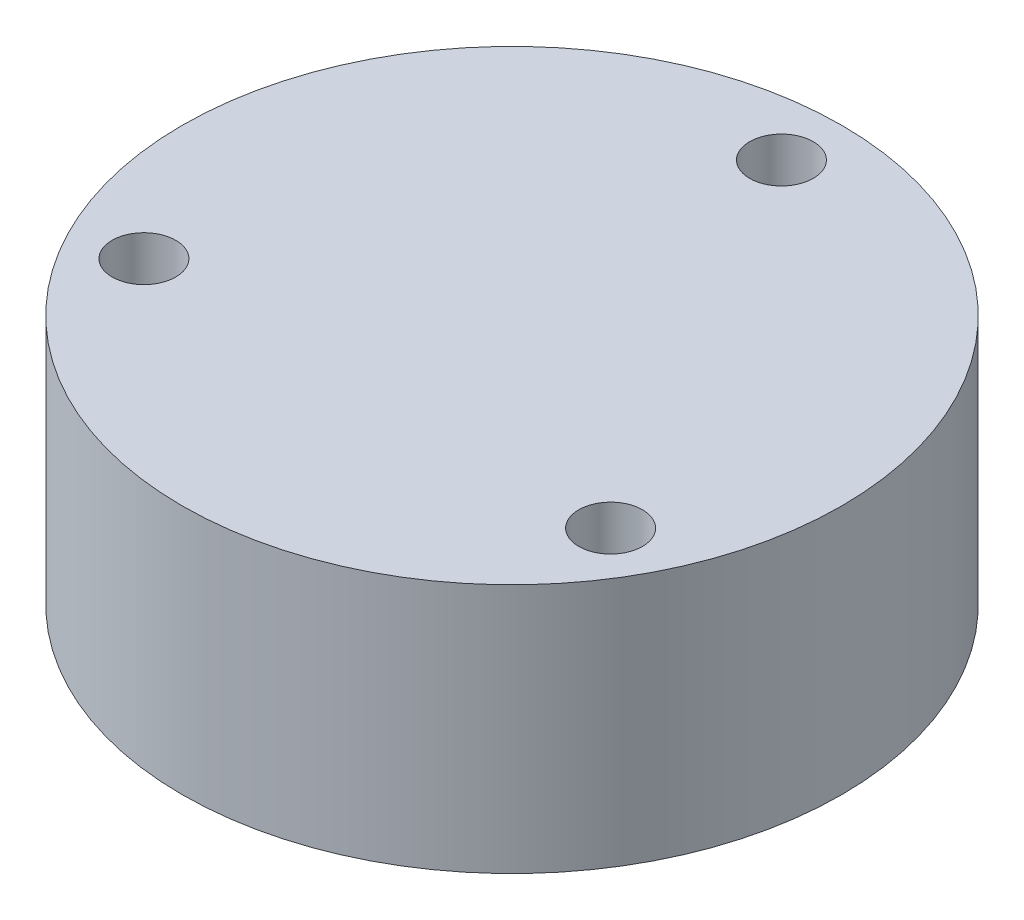
ISO-10303-21;
HEADER;
FILE_DESCRIPTION(('STEP AP214'),'2;1');
FILE_NAME('part.step','',(''),(''),'','','');
FILE_SCHEMA(('AUTOMOTIVE_DESIGN { 1 0 10303 214 1 1 1 1 }'));
ENDSEC;
DATA;
#1=APPLICATION_CONTEXT('core data for automotive mechanical design processes');
#2=APPLICATION_PROTOCOL_DEFINITION('international standard','automotive_design',2000,#1);
#3=PRODUCT_CONTEXT('',#1,'mechanical');
#4=PRODUCT('Part','Part','',(#3));
#5=PRODUCT_RELATED_PRODUCT_CATEGORY('part','',(#4));
#6=PRODUCT_DEFINITION_FORMATION('','',#4);
#7=PRODUCT_DEFINITION_CONTEXT('part definition',#1,'design');
#8=PRODUCT_DEFINITION('design','',#6,#7);
#9=PRODUCT_DEFINITION_SHAPE('','',#8);
#10=(LENGTH_UNIT() NAMED_UNIT(*) SI_UNIT(.MILLI.,.METRE.));
#11=(NAMED_UNIT(*) PLANE_ANGLE_UNIT() SI_UNIT($,.RADIAN.));
#12=(NAMED_UNIT(*) SI_UNIT($,.STERADIAN.) SOLID_ANGLE_UNIT());
#13=UNCERTAINTY_MEASURE_WITH_UNIT(LENGTH_MEASURE(1.E-05),#10,'distance_accuracy_value','');
#14=(GEOMETRIC_REPRESENTATION_CONTEXT(3) GLOBAL_UNCERTAINTY_ASSIGNED_CONTEXT((#13)) GLOBAL_UNIT_ASSIGNED_CONTEXT((#10,
#11,#12)) REPRESENTATION_CONTEXT('',''));
#15=CARTESIAN_POINT('',(0.,0.,0.));
#16=DIRECTION('',(0.,0.,1.));
#17=DIRECTION('',(1.,0.,0.));
#18=AXIS2_PLACEMENT_3D('',#15,#16,#17);
#19=CARTESIAN_POINT('',(0.,22.,0.));
#20=DIRECTION('',(0.,-1.,0.));
#21=DIRECTION('',(0.,0.,-1.));
#22=AXIS2_PLACEMENT_3D('',#19,#20,#21);
#23=CYLINDRICAL_SURFACE('',#22,29.);
#24=CARTESIAN_POINT('',(0.,22.,0.));
#25=DIRECTION('',(0.,1.,0.));
#26=DIRECTION('',(0.,0.,1.));
#27=AXIS2_PLACEMENT_3D('',#24,#25,#26);
#28=CIRCLE('',#27,29.);
#29=CARTESIAN_POINT('',(0.,22.,29.));
#30=VERTEX_POINT('',#29);
#31=EDGE_CURVE('E10',#30,#30,#28,.T.);
#32=ORIENTED_EDGE('',*,*,#31,.F.);
#33=EDGE_LOOP('',(#32));
#34=FACE_BOUND('',#33,.T.);
#35=CARTESIAN_POINT('',(0.,0.,0.));
#36=DIRECTION('',(0.,1.,0.));
#37=DIRECTION('',(0.,0.,1.));
#38=AXIS2_PLACEMENT_3D('',#35,#36,#37);
#39=CIRCLE('',#38,29.);
#40=CARTESIAN_POINT('',(0.,0.,29.));
#41=VERTEX_POINT('',#40);
#42=EDGE_CURVE('E40',#41,#41,#39,.T.);
#43=ORIENTED_EDGE('',*,*,#42,.T.);
#44=EDGE_LOOP('',(#43));
#45=FACE_BOUND('',#44,.T.);
#46=ADVANCED_FACE('F37',(#34,#45),#23,.T.);
#47=CARTESIAN_POINT('',(0.,22.,0.));
#48=DIRECTION('',(0.,1.,0.));
#49=DIRECTION('',(0.,0.,1.));
#50=AXIS2_PLACEMENT_3D('',#47,#48,#49);
#51=PLANE('',#50);
#52=CARTESIAN_POINT('',(0.,22.,-23.7));
#53=DIRECTION('',(0.,1.,0.));
#54=DIRECTION('',(0.,0.,1.));
#55=AXIS2_PLACEMENT_3D('',#52,#53,#54);
#56=CIRCLE('',#55,2.8);
#57=CARTESIAN_POINT('',(0.,22.,-20.9));
#58=VERTEX_POINT('',#57);
#59=EDGE_CURVE('E61',#58,#58,#56,.T.);
#60=ORIENTED_EDGE('',*,*,#59,.F.);
#61=EDGE_LOOP('',(#60));
#62=FACE_BOUND('',#61,.T.);
#63=CARTESIAN_POINT('',(20.5248020696922,22.,11.8499999999994));
#64=DIRECTION('',(0.,1.,0.));
#65=DIRECTION('',(0.,0.,1.));
#66=AXIS2_PLACEMENT_3D('',#63,#64,#65);
#67=CIRCLE('',#66,2.8000000000009);
#68=CARTESIAN_POINT('',(20.5248020696922,22.,14.6500000000003));
#69=VERTEX_POINT('',#68);
#70=EDGE_CURVE('E58',#69,#69,#67,.T.);
#71=ORIENTED_EDGE('',*,*,#70,.F.);
#72=EDGE_LOOP('',(#71));
#73=FACE_BOUND('',#72,.T.);
#74=CARTESIAN_POINT('',(-20.5248020696902,22.,11.8500000000006));
#75=DIRECTION('',(0.,1.,0.));
#76=DIRECTION('',(0.,0.,1.));
#77=AXIS2_PLACEMENT_3D('',#74,#75,#76);
#78=CIRCLE('',#77,2.80000000000133);
#79=CARTESIAN_POINT('',(-20.5248020696902,22.,14.6500000000019));
#80=VERTEX_POINT('',#79);
#81=EDGE_CURVE('E52',#80,#80,#78,.T.);
#82=ORIENTED_EDGE('',*,*,#81,.F.);
#83=EDGE_LOOP('',(#82));
#84=FACE_BOUND('',#83,.T.);
#85=ORIENTED_EDGE('',*,*,#31,.T.);
#86=EDGE_LOOP('',(#85));
#87=FACE_BOUND('',#86,.T.);
#88=ADVANCED_FACE('F77',(#62,#73,#84,#87),#51,.T.);
#89=CARTESIAN_POINT('',(0.,0.,0.));
#90=DIRECTION('',(0.,1.,0.));
#91=DIRECTION('',(0.,0.,1.));
#92=AXIS2_PLACEMENT_3D('',#89,#90,#91);
#93=PLANE('',#92);
#94=CARTESIAN_POINT('',(0.,0.,-23.7));
#95=DIRECTION('',(0.,1.,0.));
#96=DIRECTION('',(0.,0.,1.));
#97=AXIS2_PLACEMENT_3D('',#94,#95,#96);
#98=CIRCLE('',#97,2.8);
#99=CARTESIAN_POINT('',(0.,0.,-20.9));
#100=VERTEX_POINT('',#99);
#101=EDGE_CURVE('E47',#100,#100,#98,.T.);
#102=ORIENTED_EDGE('',*,*,#101,.T.);
#103=EDGE_LOOP('',(#102));
#104=FACE_BOUND('',#103,.T.);
#105=CARTESIAN_POINT('',(20.5248020696922,0.,11.8499999999994));
#106=DIRECTION('',(0.,1.,0.));
#107=DIRECTION('',(0.,0.,1.));
#108=AXIS2_PLACEMENT_3D('',#105,#106,#107);
#109=CIRCLE('',#108,2.8000000000009);
#110=CARTESIAN_POINT('',(20.5248020696922,0.,14.6500000000003));
#111=VERTEX_POINT('',#110);
#112=EDGE_CURVE('E55',#111,#111,#109,.T.);
#113=ORIENTED_EDGE('',*,*,#112,.T.);
#114=EDGE_LOOP('',(#113));
#115=FACE_BOUND('',#114,.T.);
#116=CARTESIAN_POINT('',(-20.5248020696902,0.,11.8500000000006));
#117=DIRECTION('',(0.,1.,0.));
#118=DIRECTION('',(0.,0.,1.));
#119=AXIS2_PLACEMENT_3D('',#116,#117,#118);
#120=CIRCLE('',#119,2.80000000000133);
#121=CARTESIAN_POINT('',(-20.5248020696902,0.,14.6500000000019));
#122=VERTEX_POINT('',#121);
#123=EDGE_CURVE('E49',#122,#122,#120,.T.);
#124=ORIENTED_EDGE('',*,*,#123,.T.);
#125=EDGE_LOOP('',(#124));
#126=FACE_BOUND('',#125,.T.);
#127=ORIENTED_EDGE('',*,*,#42,.F.);
#128=EDGE_LOOP('',(#127));
#129=FACE_BOUND('',#128,.T.);
#130=ADVANCED_FACE('F67',(#104,#115,#126,#129),#93,.F.);
#131=CARTESIAN_POINT('',(-20.5248020696902,0.,11.8500000000006));
#132=DIRECTION('',(0.,1.,0.));
#133=DIRECTION('',(0.,0.,1.));
#134=AXIS2_PLACEMENT_3D('',#131,#132,#133);
#135=CYLINDRICAL_SURFACE('',#134,2.80000000000133);
#136=ORIENTED_EDGE('',*,*,#123,.F.);
#137=EDGE_LOOP('',(#136));
#138=FACE_BOUND('',#137,.T.);
#139=ORIENTED_EDGE('',*,*,#81,.T.);
#140=EDGE_LOOP('',(#139));
#141=FACE_BOUND('',#140,.T.);
#142=ADVANCED_FACE('F85',(#138,#141),#135,.F.);
#143=CARTESIAN_POINT('',(20.5248020696922,0.,11.8499999999994));
#144=DIRECTION('',(0.,1.,0.));
#145=DIRECTION('',(0.,0.,1.));
#146=AXIS2_PLACEMENT_3D('',#143,#144,#145);
#147=CYLINDRICAL_SURFACE('',#146,2.8000000000009);
#148=ORIENTED_EDGE('',*,*,#112,.F.);
#149=EDGE_LOOP('',(#148));
#150=FACE_BOUND('',#149,.T.);
#151=ORIENTED_EDGE('',*,*,#70,.T.);
#152=EDGE_LOOP('',(#151));
#153=FACE_BOUND('',#152,.T.);
#154=ADVANCED_FACE('F73',(#150,#153),#147,.F.);
#155=CARTESIAN_POINT('',(0.,0.,-23.7));
#156=DIRECTION('',(0.,1.,0.));
#157=DIRECTION('',(0.,0.,1.));
#158=AXIS2_PLACEMENT_3D('',#155,#156,#157);
#159=CYLINDRICAL_SURFACE('',#158,2.8);
#160=ORIENTED_EDGE('',*,*,#101,.F.);
#161=EDGE_LOOP('',(#160));
#162=FACE_BOUND('',#161,.T.);
#163=ORIENTED_EDGE('',*,*,#59,.T.);
#164=EDGE_LOOP('',(#163));
#165=FACE_BOUND('',#164,.T.);
#166=ADVANCED_FACE('F70',(#162,#165),#159,.F.);
#167=CLOSED_SHELL('',(#46,#88,#130,#142,#154,#166));
#168=MANIFOLD_SOLID_BREP('B2',#167);
#169=ADVANCED_BREP_SHAPE_REPRESENTATION('',(#18,#168),#14);
#170=SHAPE_DEFINITION_REPRESENTATION(#9,#169);
ENDSEC;
END-ISO-10303-21;
